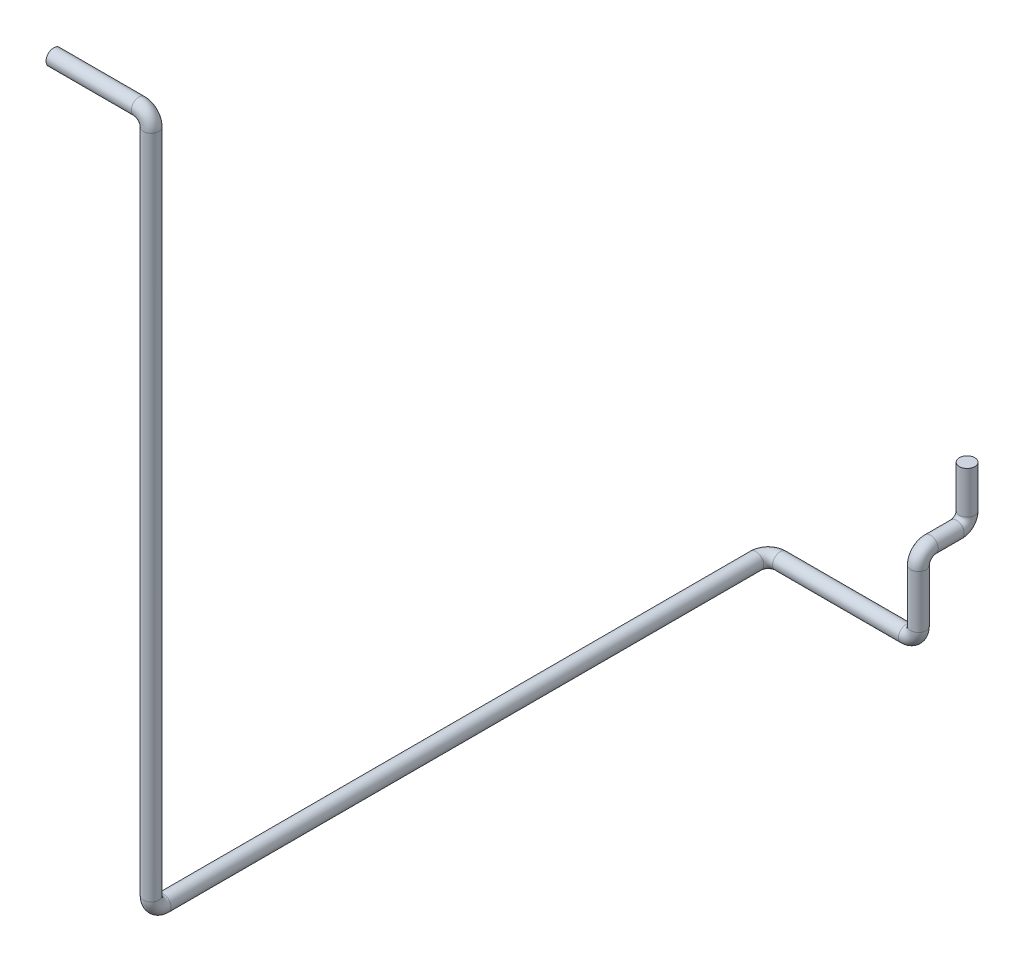
ISO-10303-21;
HEADER;
FILE_DESCRIPTION(('STEP AP214'),'2;1');
FILE_NAME('part.step','',(''),(''),'','','');
FILE_SCHEMA(('AUTOMOTIVE_DESIGN { 1 0 10303 214 1 1 1 1 }'));
ENDSEC;
DATA;
#1=APPLICATION_CONTEXT('core data for automotive mechanical design processes');
#2=APPLICATION_PROTOCOL_DEFINITION('international standard','automotive_design',2000,#1);
#3=PRODUCT_CONTEXT('',#1,'mechanical');
#4=PRODUCT('Part','Part','',(#3));
#5=PRODUCT_RELATED_PRODUCT_CATEGORY('part','',(#4));
#6=PRODUCT_DEFINITION_FORMATION('','',#4);
#7=PRODUCT_DEFINITION_CONTEXT('part definition',#1,'design');
#8=PRODUCT_DEFINITION('design','',#6,#7);
#9=PRODUCT_DEFINITION_SHAPE('','',#8);
#10=(LENGTH_UNIT() NAMED_UNIT(*) SI_UNIT(.MILLI.,.METRE.));
#11=(NAMED_UNIT(*) PLANE_ANGLE_UNIT() SI_UNIT($,.RADIAN.));
#12=(NAMED_UNIT(*) SI_UNIT($,.STERADIAN.) SOLID_ANGLE_UNIT());
#13=UNCERTAINTY_MEASURE_WITH_UNIT(LENGTH_MEASURE(1.E-05),#10,'distance_accuracy_value','');
#14=(GEOMETRIC_REPRESENTATION_CONTEXT(3) GLOBAL_UNCERTAINTY_ASSIGNED_CONTEXT((#13)) GLOBAL_UNIT_ASSIGNED_CONTEXT((#10,
#11,#12)) REPRESENTATION_CONTEXT('',''));
#15=CARTESIAN_POINT('',(0.,0.,0.));
#16=DIRECTION('',(0.,0.,1.));
#17=DIRECTION('',(1.,0.,0.));
#18=AXIS2_PLACEMENT_3D('',#15,#16,#17);
#19=CARTESIAN_POINT('',(0.,-10.,0.));
#20=DIRECTION('',(0.,1.,0.));
#21=DIRECTION('',(0.,0.,1.));
#22=AXIS2_PLACEMENT_3D('',#19,#20,#21);
#23=CYLINDRICAL_SURFACE('',#22,9.525);
#24=CARTESIAN_POINT('',(0.,0.,0.));
#25=DIRECTION('',(0.,1.,0.));
#26=DIRECTION('',(0.,0.,1.));
#27=AXIS2_PLACEMENT_3D('',#24,#25,#26);
#28=CIRCLE('',#27,9.525);
#29=CARTESIAN_POINT('',(0.,0.,9.525));
#30=VERTEX_POINT('',#29);
#31=EDGE_CURVE('E11',#30,#30,#28,.T.);
#32=ORIENTED_EDGE('',*,*,#31,.F.);
#33=EDGE_LOOP('',(#32));
#34=FACE_BOUND('',#33,.T.);
#35=CARTESIAN_POINT('',(0.,-52.,0.));
#36=DIRECTION('',(0.,-1.,0.));
#37=DIRECTION('',(0.,0.,-1.));
#38=AXIS2_PLACEMENT_3D('',#35,#36,#37);
#39=CIRCLE('',#38,9.525);
#40=CARTESIAN_POINT('',(0.,-52.,-9.525));
#41=VERTEX_POINT('',#40);
#42=EDGE_CURVE('E81',#41,#41,#39,.T.);
#43=ORIENTED_EDGE('',*,*,#42,.F.);
#44=EDGE_LOOP('',(#43));
#45=FACE_BOUND('',#44,.T.);
#46=ADVANCED_FACE('F35',(#34,#45),#23,.T.);
#47=CARTESIAN_POINT('',(0.,0.,0.));
#48=DIRECTION('',(0.,1.,0.));
#49=DIRECTION('',(0.,0.,1.));
#50=AXIS2_PLACEMENT_3D('',#47,#48,#49);
#51=PLANE('',#50);
#52=ORIENTED_EDGE('',*,*,#31,.T.);
#53=EDGE_LOOP('',(#52));
#54=FACE_BOUND('',#53,.T.);
#55=ADVANCED_FACE('F88',(#54),#51,.T.);
#56=CARTESIAN_POINT('',(-305.,690.,820.));
#57=DIRECTION('',(-1.,0.,0.));
#58=DIRECTION('',(0.,-1.,0.));
#59=AXIS2_PLACEMENT_3D('',#56,#57,#58);
#60=PLANE('',#59);
#61=CARTESIAN_POINT('',(-305.,690.,820.));
#62=DIRECTION('',(-1.,0.,0.));
#63=DIRECTION('',(0.,-1.,0.));
#64=AXIS2_PLACEMENT_3D('',#61,#62,#63);
#65=CIRCLE('',#64,9.525);
#66=CARTESIAN_POINT('',(-305.,680.475,820.));
#67=VERTEX_POINT('',#66);
#68=EDGE_CURVE('E41',#67,#67,#65,.T.);
#69=ORIENTED_EDGE('',*,*,#68,.T.);
#70=EDGE_LOOP('',(#69));
#71=FACE_BOUND('',#70,.T.);
#72=ADVANCED_FACE('F45',(#71),#60,.T.);
#73=CARTESIAN_POINT('',(0.,-52.,13.));
#74=DIRECTION('',(-1.,0.,0.));
#75=DIRECTION('',(0.,0.,1.));
#76=AXIS2_PLACEMENT_3D('',#73,#74,#75);
#77=TOROIDAL_SURFACE('',#76,13.,9.525);
#78=CARTESIAN_POINT('',(0.,-65.,13.));
#79=DIRECTION('',(0.,0.,1.));
#80=DIRECTION('',(0.,-1.,0.));
#81=AXIS2_PLACEMENT_3D('',#78,#79,#80);
#82=CIRCLE('',#81,9.525);
#83=CARTESIAN_POINT('',(0.,-74.525,13.));
#84=VERTEX_POINT('',#83);
#85=EDGE_CURVE('E78',#84,#84,#82,.T.);
#86=CARTESIAN_POINT('',(0.,-52.,13.));
#87=DIRECTION('',(-1.,0.,0.));
#88=DIRECTION('',(0.,0.,1.));
#89=AXIS2_PLACEMENT_3D('',#86,#87,#88);
#90=CIRCLE('',#89,22.525);
#91=EDGE_CURVE('',#41,#84,#90,.T.);
#92=ORIENTED_EDGE('',*,*,#42,.T.);
#93=ORIENTED_EDGE('',*,*,#85,.F.);
#94=ORIENTED_EDGE('',*,*,#91,.T.);
#95=ORIENTED_EDGE('',*,*,#91,.F.);
#96=EDGE_LOOP('',(#92,#94,#93,#95));
#97=FACE_BOUND('',#96,.T.);
#98=ADVANCED_FACE('F85',(#97),#77,.T.);
#99=CARTESIAN_POINT('',(0.,-65.,13.));
#100=DIRECTION('',(0.,0.,1.));
#101=DIRECTION('',(1.,0.,0.));
#102=AXIS2_PLACEMENT_3D('',#99,#100,#101);
#103=CYLINDRICAL_SURFACE('',#102,9.525);
#104=CARTESIAN_POINT('',(0.,-65.,45.));
#105=DIRECTION('',(0.,0.,1.));
#106=DIRECTION('',(0.,-1.,0.));
#107=AXIS2_PLACEMENT_3D('',#104,#105,#106);
#108=CIRCLE('',#107,9.525);
#109=CARTESIAN_POINT('',(0.,-55.475,45.));
#110=VERTEX_POINT('',#109);
#111=EDGE_CURVE('E75',#110,#110,#108,.T.);
#112=ORIENTED_EDGE('',*,*,#111,.F.);
#113=EDGE_LOOP('',(#112));
#114=FACE_BOUND('',#113,.T.);
#115=ORIENTED_EDGE('',*,*,#85,.T.);
#116=EDGE_LOOP('',(#115));
#117=FACE_BOUND('',#116,.T.);
#118=ADVANCED_FACE('F141',(#114,#117),#103,.T.);
#119=CARTESIAN_POINT('',(0.,-80.,45.));
#120=DIRECTION('',(1.,0.,0.));
#121=DIRECTION('',(0.,0.,-1.));
#122=AXIS2_PLACEMENT_3D('',#119,#120,#121);
#123=TOROIDAL_SURFACE('',#122,15.,9.525);
#124=CARTESIAN_POINT('',(0.,-80.,60.));
#125=DIRECTION('',(0.,-1.,0.));
#126=DIRECTION('',(0.,0.,-1.));
#127=AXIS2_PLACEMENT_3D('',#124,#125,#126);
#128=CIRCLE('',#127,9.525);
#129=CARTESIAN_POINT('',(0.,-80.,69.525));
#130=VERTEX_POINT('',#129);
#131=EDGE_CURVE('E72',#130,#130,#128,.T.);
#132=CARTESIAN_POINT('',(0.,-80.,45.));
#133=DIRECTION('',(1.,0.,0.));
#134=DIRECTION('',(0.,0.,-1.));
#135=AXIS2_PLACEMENT_3D('',#132,#133,#134);
#136=CIRCLE('',#135,24.525);
#137=EDGE_CURVE('',#110,#130,#136,.T.);
#138=ORIENTED_EDGE('',*,*,#111,.T.);
#139=ORIENTED_EDGE('',*,*,#131,.F.);
#140=ORIENTED_EDGE('',*,*,#137,.T.);
#141=ORIENTED_EDGE('',*,*,#137,.F.);
#142=EDGE_LOOP('',(#138,#140,#139,#141));
#143=FACE_BOUND('',#142,.T.);
#144=ADVANCED_FACE('F137',(#143),#123,.T.);
#145=CARTESIAN_POINT('',(0.,-80.,60.));
#146=DIRECTION('',(0.,-1.,0.));
#147=DIRECTION('',(1.,0.,0.));
#148=AXIS2_PLACEMENT_3D('',#145,#146,#147);
#149=CYLINDRICAL_SURFACE('',#148,9.525);
#150=CARTESIAN_POINT('',(0.,-145.,60.));
#151=DIRECTION('',(0.,-1.,0.));
#152=DIRECTION('',(0.,0.,-1.));
#153=AXIS2_PLACEMENT_3D('',#150,#151,#152);
#154=CIRCLE('',#153,9.525);
#155=CARTESIAN_POINT('',(9.525,-145.,60.));
#156=VERTEX_POINT('',#155);
#157=EDGE_CURVE('E69',#156,#156,#154,.T.);
#158=ORIENTED_EDGE('',*,*,#157,.F.);
#159=EDGE_LOOP('',(#158));
#160=FACE_BOUND('',#159,.T.);
#161=ORIENTED_EDGE('',*,*,#131,.T.);
#162=EDGE_LOOP('',(#161));
#163=FACE_BOUND('',#162,.T.);
#164=ADVANCED_FACE('F133',(#160,#163),#149,.T.);
#165=CARTESIAN_POINT('',(-15.,-145.,60.));
#166=DIRECTION('',(0.,0.,-1.));
#167=DIRECTION('',(-1.,0.,0.));
#168=AXIS2_PLACEMENT_3D('',#165,#166,#167);
#169=TOROIDAL_SURFACE('',#168,15.,9.525);
#170=CARTESIAN_POINT('',(-15.,-160.,60.));
#171=DIRECTION('',(-1.,0.,0.));
#172=DIRECTION('',(0.,0.,-1.));
#173=AXIS2_PLACEMENT_3D('',#170,#171,#172);
#174=CIRCLE('',#173,9.525);
#175=CARTESIAN_POINT('',(-15.,-169.525,60.));
#176=VERTEX_POINT('',#175);
#177=EDGE_CURVE('E66',#176,#176,#174,.T.);
#178=CARTESIAN_POINT('',(-15.,-145.,60.));
#179=DIRECTION('',(0.,0.,-1.));
#180=DIRECTION('',(-1.,0.,0.));
#181=AXIS2_PLACEMENT_3D('',#178,#179,#180);
#182=CIRCLE('',#181,24.525);
#183=EDGE_CURVE('',#156,#176,#182,.T.);
#184=ORIENTED_EDGE('',*,*,#157,.T.);
#185=ORIENTED_EDGE('',*,*,#177,.F.);
#186=ORIENTED_EDGE('',*,*,#183,.T.);
#187=ORIENTED_EDGE('',*,*,#183,.F.);
#188=EDGE_LOOP('',(#184,#186,#185,#187));
#189=FACE_BOUND('',#188,.T.);
#190=ADVANCED_FACE('F129',(#189),#169,.T.);
#191=CARTESIAN_POINT('',(-15.,-160.,60.));
#192=DIRECTION('',(-1.,0.,0.));
#193=DIRECTION('',(0.,0.,1.));
#194=AXIS2_PLACEMENT_3D('',#191,#192,#193);
#195=CYLINDRICAL_SURFACE('',#194,9.525);
#196=CARTESIAN_POINT('',(-170.,-160.,60.));
#197=DIRECTION('',(-1.,0.,0.));
#198=DIRECTION('',(0.,0.,-1.));
#199=AXIS2_PLACEMENT_3D('',#196,#197,#198);
#200=CIRCLE('',#199,9.525);
#201=CARTESIAN_POINT('',(-170.,-160.,50.475));
#202=VERTEX_POINT('',#201);
#203=EDGE_CURVE('E63',#202,#202,#200,.T.);
#204=ORIENTED_EDGE('',*,*,#203,.F.);
#205=EDGE_LOOP('',(#204));
#206=FACE_BOUND('',#205,.T.);
#207=ORIENTED_EDGE('',*,*,#177,.T.);
#208=EDGE_LOOP('',(#207));
#209=FACE_BOUND('',#208,.T.);
#210=ADVANCED_FACE('F125',(#206,#209),#195,.T.);
#211=CARTESIAN_POINT('',(-170.,-160.,75.));
#212=DIRECTION('',(0.,1.,0.));
#213=DIRECTION('',(0.,0.,1.));
#214=AXIS2_PLACEMENT_3D('',#211,#212,#213);
#215=TOROIDAL_SURFACE('',#214,15.,9.525);
#216=CARTESIAN_POINT('',(-185.,-160.,75.));
#217=DIRECTION('',(0.,0.,1.));
#218=DIRECTION('',(-1.,0.,0.));
#219=AXIS2_PLACEMENT_3D('',#216,#217,#218);
#220=CIRCLE('',#219,9.525);
#221=CARTESIAN_POINT('',(-194.525,-160.,75.));
#222=VERTEX_POINT('',#221);
#223=EDGE_CURVE('E60',#222,#222,#220,.T.);
#224=CARTESIAN_POINT('',(-170.,-160.,75.));
#225=DIRECTION('',(0.,1.,0.));
#226=DIRECTION('',(0.,0.,1.));
#227=AXIS2_PLACEMENT_3D('',#224,#225,#226);
#228=CIRCLE('',#227,24.525);
#229=EDGE_CURVE('',#202,#222,#228,.T.);
#230=ORIENTED_EDGE('',*,*,#203,.T.);
#231=ORIENTED_EDGE('',*,*,#223,.F.);
#232=ORIENTED_EDGE('',*,*,#229,.T.);
#233=ORIENTED_EDGE('',*,*,#229,.F.);
#234=EDGE_LOOP('',(#230,#232,#231,#233));
#235=FACE_BOUND('',#234,.T.);
#236=ADVANCED_FACE('F121',(#235),#215,.T.);
#237=CARTESIAN_POINT('',(-185.,-160.,75.));
#238=DIRECTION('',(0.,0.,1.));
#239=DIRECTION('',(1.,0.,0.));
#240=AXIS2_PLACEMENT_3D('',#237,#238,#239);
#241=CYLINDRICAL_SURFACE('',#240,9.525);
#242=CARTESIAN_POINT('',(-185.,-160.,805.));
#243=DIRECTION('',(0.,0.,1.));
#244=DIRECTION('',(-1.,0.,0.));
#245=AXIS2_PLACEMENT_3D('',#242,#243,#244);
#246=CIRCLE('',#245,9.525);
#247=CARTESIAN_POINT('',(-185.,-169.525,805.));
#248=VERTEX_POINT('',#247);
#249=EDGE_CURVE('E57',#248,#248,#246,.T.);
#250=ORIENTED_EDGE('',*,*,#249,.F.);
#251=EDGE_LOOP('',(#250));
#252=FACE_BOUND('',#251,.T.);
#253=ORIENTED_EDGE('',*,*,#223,.T.);
#254=EDGE_LOOP('',(#253));
#255=FACE_BOUND('',#254,.T.);
#256=ADVANCED_FACE('F117',(#252,#255),#241,.T.);
#257=CARTESIAN_POINT('',(-185.,-145.,805.));
#258=DIRECTION('',(-1.,0.,0.));
#259=DIRECTION('',(0.,0.,1.));
#260=AXIS2_PLACEMENT_3D('',#257,#258,#259);
#261=TOROIDAL_SURFACE('',#260,15.,9.525);
#262=CARTESIAN_POINT('',(-185.,-145.,820.));
#263=DIRECTION('',(0.,1.,0.));
#264=DIRECTION('',(-1.,0.,0.));
#265=AXIS2_PLACEMENT_3D('',#262,#263,#264);
#266=CIRCLE('',#265,9.525);
#267=CARTESIAN_POINT('',(-185.,-145.,829.525));
#268=VERTEX_POINT('',#267);
#269=EDGE_CURVE('E54',#268,#268,#266,.T.);
#270=CARTESIAN_POINT('',(-185.,-145.,805.));
#271=DIRECTION('',(-1.,0.,0.));
#272=DIRECTION('',(0.,0.,1.));
#273=AXIS2_PLACEMENT_3D('',#270,#271,#272);
#274=CIRCLE('',#273,24.525);
#275=EDGE_CURVE('',#248,#268,#274,.T.);
#276=ORIENTED_EDGE('',*,*,#249,.T.);
#277=ORIENTED_EDGE('',*,*,#269,.F.);
#278=ORIENTED_EDGE('',*,*,#275,.T.);
#279=ORIENTED_EDGE('',*,*,#275,.F.);
#280=EDGE_LOOP('',(#276,#278,#277,#279));
#281=FACE_BOUND('',#280,.T.);
#282=ADVANCED_FACE('F113',(#281),#261,.T.);
#283=CARTESIAN_POINT('',(-185.,-145.,820.));
#284=DIRECTION('',(0.,1.,0.));
#285=DIRECTION('',(-1.,0.,0.));
#286=AXIS2_PLACEMENT_3D('',#283,#284,#285);
#287=CYLINDRICAL_SURFACE('',#286,9.525);
#288=CARTESIAN_POINT('',(-185.,675.,820.));
#289=DIRECTION('',(0.,1.,0.));
#290=DIRECTION('',(-1.,0.,0.));
#291=AXIS2_PLACEMENT_3D('',#288,#289,#290);
#292=CIRCLE('',#291,9.525);
#293=CARTESIAN_POINT('',(-175.475,675.,820.));
#294=VERTEX_POINT('',#293);
#295=EDGE_CURVE('E49',#294,#294,#292,.T.);
#296=ORIENTED_EDGE('',*,*,#295,.F.);
#297=EDGE_LOOP('',(#296));
#298=FACE_BOUND('',#297,.T.);
#299=ORIENTED_EDGE('',*,*,#269,.T.);
#300=EDGE_LOOP('',(#299));
#301=FACE_BOUND('',#300,.T.);
#302=ADVANCED_FACE('F106',(#298,#301),#287,.T.);
#303=CARTESIAN_POINT('',(-200.,675.,820.));
#304=DIRECTION('',(0.,0.,1.));
#305=DIRECTION('',(1.,0.,0.));
#306=AXIS2_PLACEMENT_3D('',#303,#304,#305);
#307=TOROIDAL_SURFACE('',#306,15.,9.525);
#308=CARTESIAN_POINT('',(-200.,690.,820.));
#309=DIRECTION('',(-1.,0.,0.));
#310=DIRECTION('',(0.,-1.,0.));
#311=AXIS2_PLACEMENT_3D('',#308,#309,#310);
#312=CIRCLE('',#311,9.525);
#313=CARTESIAN_POINT('',(-200.,699.525,820.));
#314=VERTEX_POINT('',#313);
#315=EDGE_CURVE('E47',#314,#314,#312,.T.);
#316=CARTESIAN_POINT('',(-200.,675.,820.));
#317=DIRECTION('',(0.,0.,1.));
#318=DIRECTION('',(1.,0.,0.));
#319=AXIS2_PLACEMENT_3D('',#316,#317,#318);
#320=CIRCLE('',#319,24.525);
#321=EDGE_CURVE('',#294,#314,#320,.T.);
#322=ORIENTED_EDGE('',*,*,#295,.T.);
#323=ORIENTED_EDGE('',*,*,#315,.F.);
#324=ORIENTED_EDGE('',*,*,#321,.T.);
#325=ORIENTED_EDGE('',*,*,#321,.F.);
#326=EDGE_LOOP('',(#322,#324,#323,#325));
#327=FACE_BOUND('',#326,.T.);
#328=ADVANCED_FACE('F101',(#327),#307,.T.);
#329=CARTESIAN_POINT('',(-200.,690.,820.));
#330=DIRECTION('',(-1.,0.,0.));
#331=DIRECTION('',(0.,0.,1.));
#332=AXIS2_PLACEMENT_3D('',#329,#330,#331);
#333=CYLINDRICAL_SURFACE('',#332,9.525);
#334=ORIENTED_EDGE('',*,*,#68,.F.);
#335=EDGE_LOOP('',(#334));
#336=FACE_BOUND('',#335,.T.);
#337=ORIENTED_EDGE('',*,*,#315,.T.);
#338=EDGE_LOOP('',(#337));
#339=FACE_BOUND('',#338,.T.);
#340=ADVANCED_FACE('F94',(#336,#339),#333,.T.);
#341=CLOSED_SHELL('',(#46,#55,#72,#98,#118,#144,#164,#190,#210,#236,#256,#282,#302,#328,#340));
#342=MANIFOLD_SOLID_BREP('B2',#341);
#343=ADVANCED_BREP_SHAPE_REPRESENTATION('',(#18,#342),#14);
#344=SHAPE_DEFINITION_REPRESENTATION(#9,#343);
ENDSEC;
END-ISO-10303-21;
